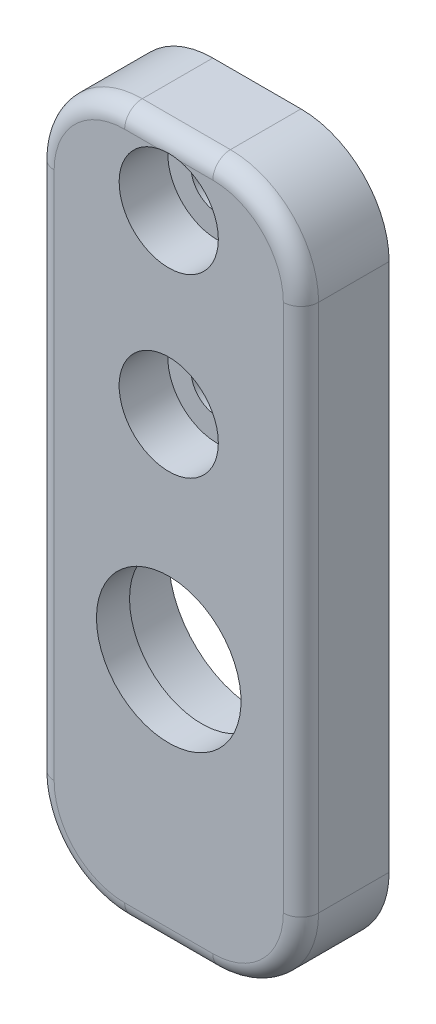
ISO-10303-21;
HEADER;
FILE_DESCRIPTION(('STEP AP214'),'2;1');
FILE_NAME('part.step','',(''),(''),'','','');
FILE_SCHEMA(('AUTOMOTIVE_DESIGN { 1 0 10303 214 1 1 1 1 }'));
ENDSEC;
DATA;
#1=APPLICATION_CONTEXT('core data for automotive mechanical design processes');
#2=APPLICATION_PROTOCOL_DEFINITION('international standard','automotive_design',2000,#1);
#3=PRODUCT_CONTEXT('',#1,'mechanical');
#4=PRODUCT('Part','Part','',(#3));
#5=PRODUCT_RELATED_PRODUCT_CATEGORY('part','',(#4));
#6=PRODUCT_DEFINITION_FORMATION('','',#4);
#7=PRODUCT_DEFINITION_CONTEXT('part definition',#1,'design');
#8=PRODUCT_DEFINITION('design','',#6,#7);
#9=PRODUCT_DEFINITION_SHAPE('','',#8);
#10=(LENGTH_UNIT() NAMED_UNIT(*) SI_UNIT(.MILLI.,.METRE.));
#11=(NAMED_UNIT(*) PLANE_ANGLE_UNIT() SI_UNIT($,.RADIAN.));
#12=(NAMED_UNIT(*) SI_UNIT($,.STERADIAN.) SOLID_ANGLE_UNIT());
#13=UNCERTAINTY_MEASURE_WITH_UNIT(LENGTH_MEASURE(1.E-05),#10,'distance_accuracy_value','');
#14=(GEOMETRIC_REPRESENTATION_CONTEXT(3) GLOBAL_UNCERTAINTY_ASSIGNED_CONTEXT((#13)) GLOBAL_UNIT_ASSIGNED_CONTEXT((#10,
#11,#12)) REPRESENTATION_CONTEXT('',''));
#15=CARTESIAN_POINT('',(0.,0.,0.));
#16=DIRECTION('',(0.,0.,1.));
#17=DIRECTION('',(1.,0.,0.));
#18=AXIS2_PLACEMENT_3D('',#15,#16,#17);
#19=CARTESIAN_POINT('',(9.525,18.034,0.));
#20=DIRECTION('',(0.,0.,-1.));
#21=DIRECTION('',(-1.,0.,0.));
#22=AXIS2_PLACEMENT_3D('',#19,#20,#21);
#23=CYLINDRICAL_SURFACE('',#22,5.207);
#24=CARTESIAN_POINT('',(9.525,18.034,0.));
#25=DIRECTION('',(0.,0.,-1.));
#26=DIRECTION('',(-1.,0.,0.));
#27=AXIS2_PLACEMENT_3D('',#24,#25,#26);
#28=CIRCLE('',#27,5.207);
#29=CARTESIAN_POINT('',(4.318,18.034,0.));
#30=VERTEX_POINT('',#29);
#31=EDGE_CURVE('E292',#30,#30,#28,.T.);
#32=ORIENTED_EDGE('',*,*,#31,.F.);
#33=EDGE_LOOP('',(#32));
#34=FACE_BOUND('',#33,.T.);
#35=CARTESIAN_POINT('',(9.525,18.034,-2.38252000000001));
#36=DIRECTION('',(0.,0.,-1.));
#37=DIRECTION('',(-1.,0.,0.));
#38=AXIS2_PLACEMENT_3D('',#35,#36,#37);
#39=CIRCLE('',#38,5.207);
#40=CARTESIAN_POINT('',(4.318,18.034,-2.38252000000001));
#41=VERTEX_POINT('',#40);
#42=EDGE_CURVE('E375',#41,#41,#39,.T.);
#43=ORIENTED_EDGE('',*,*,#42,.T.);
#44=EDGE_LOOP('',(#43));
#45=FACE_BOUND('',#44,.T.);
#46=ADVANCED_FACE('F32',(#34,#45),#23,.F.);
#47=CARTESIAN_POINT('',(19.05,0.,0.));
#48=DIRECTION('',(0.,1.,0.));
#49=DIRECTION('',(0.,0.,1.));
#50=AXIS2_PLACEMENT_3D('',#47,#48,#49);
#51=PLANE('',#50);
#52=DIRECTION('',(0.,0.,-1.));
#53=VECTOR('',#52,1.);
#54=CARTESIAN_POINT('',(12.7,0.,0.));
#55=LINE('',#54,#53);
#56=CARTESIAN_POINT('',(12.7,0.,-6.35000000000001));
#57=VERTEX_POINT('',#56);
#58=CARTESIAN_POINT('',(12.7,0.,-1.27));
#59=VERTEX_POINT('',#58);
#60=EDGE_CURVE('E166',#57,#59,#55,.F.);
#61=ORIENTED_EDGE('',*,*,#60,.T.);
#62=DIRECTION('',(-1.,0.,0.));
#63=VECTOR('',#62,1.);
#64=CARTESIAN_POINT('',(19.05,0.,-1.27));
#65=LINE('',#64,#63);
#66=CARTESIAN_POINT('',(6.35,0.,-1.27));
#67=VERTEX_POINT('',#66);
#68=EDGE_CURVE('E314',#59,#67,#65,.T.);
#69=ORIENTED_EDGE('',*,*,#68,.T.);
#70=DIRECTION('',(0.,0.,-1.));
#71=VECTOR('',#70,1.);
#72=CARTESIAN_POINT('',(6.35,0.,-6.35000000000001));
#73=LINE('',#72,#71);
#74=CARTESIAN_POINT('',(6.35,0.,-6.35000000000001));
#75=VERTEX_POINT('',#74);
#76=EDGE_CURVE('E168',#67,#75,#73,.T.);
#77=ORIENTED_EDGE('',*,*,#76,.T.);
#78=DIRECTION('',(-1.,0.,0.));
#79=VECTOR('',#78,1.);
#80=CARTESIAN_POINT('',(19.05,0.,-6.35000000000001));
#81=LINE('',#80,#79);
#82=EDGE_CURVE('E141',#57,#75,#81,.T.);
#83=ORIENTED_EDGE('',*,*,#82,.F.);
#84=EDGE_LOOP('',(#61,#69,#77,#83));
#85=FACE_BOUND('',#84,.T.);
#86=ADVANCED_FACE('F235',(#85),#51,.F.);
#87=CARTESIAN_POINT('',(19.05,50.8,-6.35));
#88=DIRECTION('',(0.,0.,1.));
#89=DIRECTION('',(0.,-1.,0.));
#90=AXIS2_PLACEMENT_3D('',#87,#88,#89);
#91=PLANE('',#90);
#92=CARTESIAN_POINT('',(9.525,18.034,-6.35000000000001));
#93=DIRECTION('',(0.,0.,-1.));
#94=DIRECTION('',(-1.,0.,0.));
#95=AXIS2_PLACEMENT_3D('',#92,#93,#94);
#96=CIRCLE('',#95,6.35);
#97=CARTESIAN_POINT('',(3.175,18.034,-6.35000000000001));
#98=VERTEX_POINT('',#97);
#99=EDGE_CURVE('E349',#98,#98,#96,.T.);
#100=ORIENTED_EDGE('',*,*,#99,.F.);
#101=EDGE_LOOP('',(#100));
#102=FACE_BOUND('',#101,.T.);
#103=CARTESIAN_POINT('',(9.52499999999999,46.0375,-6.35));
#104=DIRECTION('',(0.,0.,1.));
#105=DIRECTION('',(1.,0.,0.));
#106=AXIS2_PLACEMENT_3D('',#103,#104,#105);
#107=CIRCLE('',#106,1.89865);
#108=CARTESIAN_POINT('',(11.42365,46.0375,-6.35));
#109=VERTEX_POINT('',#108);
#110=EDGE_CURVE('E354',#109,#109,#107,.T.);
#111=ORIENTED_EDGE('',*,*,#110,.T.);
#112=EDGE_LOOP('',(#111));
#113=FACE_BOUND('',#112,.T.);
#114=CARTESIAN_POINT('',(9.525,33.3375,-6.35));
#115=DIRECTION('',(0.,0.,1.));
#116=DIRECTION('',(1.,0.,0.));
#117=AXIS2_PLACEMENT_3D('',#114,#115,#116);
#118=CIRCLE('',#117,1.89865);
#119=CARTESIAN_POINT('',(11.42365,33.3375,-6.35));
#120=VERTEX_POINT('',#119);
#121=EDGE_CURVE('E365',#120,#120,#118,.T.);
#122=ORIENTED_EDGE('',*,*,#121,.T.);
#123=EDGE_LOOP('',(#122));
#124=FACE_BOUND('',#123,.T.);
#125=DIRECTION('',(0.,1.,0.));
#126=VECTOR('',#125,1.);
#127=CARTESIAN_POINT('',(0.,50.8,-6.35));
#128=LINE('',#127,#126);
#129=CARTESIAN_POINT('',(0.,6.35,-6.35));
#130=VERTEX_POINT('',#129);
#131=CARTESIAN_POINT('',(0.,44.45,-6.35));
#132=VERTEX_POINT('',#131);
#133=EDGE_CURVE('E290',#130,#132,#128,.T.);
#134=ORIENTED_EDGE('',*,*,#133,.T.);
#135=CARTESIAN_POINT('',(6.35,44.45,-6.35));
#136=DIRECTION('',(0.,0.,1.));
#137=DIRECTION('',(0.,-1.,0.));
#138=AXIS2_PLACEMENT_3D('',#135,#136,#137);
#139=CIRCLE('',#138,6.35);
#140=CARTESIAN_POINT('',(6.35,50.8,-6.35));
#141=VERTEX_POINT('',#140);
#142=EDGE_CURVE('E150',#132,#141,#139,.F.);
#143=ORIENTED_EDGE('',*,*,#142,.T.);
#144=DIRECTION('',(-1.,0.,0.));
#145=VECTOR('',#144,1.);
#146=CARTESIAN_POINT('',(19.05,50.8,-6.35));
#147=LINE('',#146,#145);
#148=CARTESIAN_POINT('',(12.7,50.8,-6.35));
#149=VERTEX_POINT('',#148);
#150=EDGE_CURVE('E132',#149,#141,#147,.T.);
#151=ORIENTED_EDGE('',*,*,#150,.F.);
#152=CARTESIAN_POINT('',(12.7,44.45,-6.35));
#153=DIRECTION('',(0.,0.,1.));
#154=DIRECTION('',(0.,-1.,0.));
#155=AXIS2_PLACEMENT_3D('',#152,#153,#154);
#156=CIRCLE('',#155,6.35);
#157=CARTESIAN_POINT('',(19.05,44.45,-6.35));
#158=VERTEX_POINT('',#157);
#159=EDGE_CURVE('E147',#149,#158,#156,.F.);
#160=ORIENTED_EDGE('',*,*,#159,.T.);
#161=DIRECTION('',(0.,1.,0.));
#162=VECTOR('',#161,1.);
#163=CARTESIAN_POINT('',(19.05,50.8,-6.35));
#164=LINE('',#163,#162);
#165=CARTESIAN_POINT('',(19.05,6.35,-6.35));
#166=VERTEX_POINT('',#165);
#167=EDGE_CURVE('E151',#166,#158,#164,.T.);
#168=ORIENTED_EDGE('',*,*,#167,.F.);
#169=CARTESIAN_POINT('',(12.7,6.35,-6.35));
#170=DIRECTION('',(0.,0.,1.));
#171=DIRECTION('',(0.,-1.,0.));
#172=AXIS2_PLACEMENT_3D('',#169,#170,#171);
#173=CIRCLE('',#172,6.35);
#174=EDGE_CURVE('E160',#166,#57,#173,.F.);
#175=ORIENTED_EDGE('',*,*,#174,.T.);
#176=ORIENTED_EDGE('',*,*,#82,.T.);
#177=CARTESIAN_POINT('',(6.35,6.35,-6.35));
#178=DIRECTION('',(0.,0.,1.));
#179=DIRECTION('',(0.,-1.,0.));
#180=AXIS2_PLACEMENT_3D('',#177,#178,#179);
#181=CIRCLE('',#180,6.35);
#182=EDGE_CURVE('E156',#75,#130,#181,.F.);
#183=ORIENTED_EDGE('',*,*,#182,.T.);
#184=EDGE_LOOP('',(#134,#143,#151,#160,#168,#175,#176,#183));
#185=FACE_BOUND('',#184,.T.);
#186=ADVANCED_FACE('F145',(#102,#113,#124,#185),#91,.F.);
#187=CARTESIAN_POINT('',(19.05,50.8,0.));
#188=DIRECTION('',(0.,-1.,0.));
#189=DIRECTION('',(0.,0.,-1.));
#190=AXIS2_PLACEMENT_3D('',#187,#188,#189);
#191=PLANE('',#190);
#192=DIRECTION('',(0.,0.,1.));
#193=VECTOR('',#192,1.);
#194=CARTESIAN_POINT('',(6.35,50.8,0.));
#195=LINE('',#194,#193);
#196=CARTESIAN_POINT('',(6.35,50.8,-1.27));
#197=VERTEX_POINT('',#196);
#198=EDGE_CURVE('E140',#141,#197,#195,.T.);
#199=ORIENTED_EDGE('',*,*,#198,.T.);
#200=DIRECTION('',(-1.,0.,0.));
#201=VECTOR('',#200,1.);
#202=CARTESIAN_POINT('',(19.05,50.8,-1.27));
#203=LINE('',#202,#201);
#204=CARTESIAN_POINT('',(12.7,50.8,-1.27));
#205=VERTEX_POINT('',#204);
#206=EDGE_CURVE('E135',#197,#205,#203,.F.);
#207=ORIENTED_EDGE('',*,*,#206,.T.);
#208=DIRECTION('',(0.,0.,1.));
#209=VECTOR('',#208,1.);
#210=CARTESIAN_POINT('',(12.7,50.8,0.));
#211=LINE('',#210,#209);
#212=EDGE_CURVE('E128',#205,#149,#211,.F.);
#213=ORIENTED_EDGE('',*,*,#212,.T.);
#214=ORIENTED_EDGE('',*,*,#150,.T.);
#215=EDGE_LOOP('',(#199,#207,#213,#214));
#216=FACE_BOUND('',#215,.T.);
#217=ADVANCED_FACE('F131',(#216),#191,.F.);
#218=CARTESIAN_POINT('',(19.05,0.,0.));
#219=DIRECTION('',(0.,0.,-1.));
#220=DIRECTION('',(-1.,0.,0.));
#221=AXIS2_PLACEMENT_3D('',#218,#219,#220);
#222=PLANE('',#221);
#223=CARTESIAN_POINT('',(12.7,44.45,0.));
#224=DIRECTION('',(0.,0.,-1.));
#225=DIRECTION('',(-1.,0.,0.));
#226=AXIS2_PLACEMENT_3D('',#223,#224,#225);
#227=CIRCLE('',#226,5.08);
#228=CARTESIAN_POINT('',(17.78,44.45,0.));
#229=VERTEX_POINT('',#228);
#230=CARTESIAN_POINT('',(12.7,49.53,0.));
#231=VERTEX_POINT('',#230);
#232=EDGE_CURVE('E184',#229,#231,#227,.F.);
#233=ORIENTED_EDGE('',*,*,#232,.T.);
#234=DIRECTION('',(-1.,0.,0.));
#235=VECTOR('',#234,1.);
#236=CARTESIAN_POINT('',(19.05,49.53,0.));
#237=LINE('',#236,#235);
#238=CARTESIAN_POINT('',(10.2768453631565,49.53,0.));
#239=VERTEX_POINT('',#238);
#240=EDGE_CURVE('E187',#231,#239,#237,.T.);
#241=ORIENTED_EDGE('',*,*,#240,.T.);
#242=CARTESIAN_POINT('',(9.52499999999999,46.0375,0.));
#243=DIRECTION('',(0.,0.,1.));
#244=DIRECTION('',(1.,0.,0.));
#245=AXIS2_PLACEMENT_3D('',#242,#243,#244);
#246=CIRCLE('',#245,3.57250999999999);
#247=CARTESIAN_POINT('',(8.77315463684349,49.53,0.));
#248=VERTEX_POINT('',#247);
#249=EDGE_CURVE('E335',#248,#239,#246,.T.);
#250=ORIENTED_EDGE('',*,*,#249,.F.);
#251=DIRECTION('',(-1.,0.,0.));
#252=VECTOR('',#251,1.);
#253=CARTESIAN_POINT('',(19.05,49.53,0.));
#254=LINE('',#253,#252);
#255=CARTESIAN_POINT('',(6.35,49.53,0.));
#256=VERTEX_POINT('',#255);
#257=EDGE_CURVE('E182',#248,#256,#254,.T.);
#258=ORIENTED_EDGE('',*,*,#257,.T.);
#259=CARTESIAN_POINT('',(6.35,44.45,0.));
#260=DIRECTION('',(0.,0.,-1.));
#261=DIRECTION('',(-1.,0.,0.));
#262=AXIS2_PLACEMENT_3D('',#259,#260,#261);
#263=CIRCLE('',#262,5.08);
#264=CARTESIAN_POINT('',(1.27,44.45,0.));
#265=VERTEX_POINT('',#264);
#266=EDGE_CURVE('E180',#256,#265,#263,.F.);
#267=ORIENTED_EDGE('',*,*,#266,.T.);
#268=DIRECTION('',(0.,-1.,0.));
#269=VECTOR('',#268,1.);
#270=CARTESIAN_POINT('',(1.27,6.35,0.));
#271=LINE('',#270,#269);
#272=CARTESIAN_POINT('',(1.27,6.35,0.));
#273=VERTEX_POINT('',#272);
#274=EDGE_CURVE('E178',#265,#273,#271,.T.);
#275=ORIENTED_EDGE('',*,*,#274,.T.);
#276=CARTESIAN_POINT('',(6.35,6.35,0.));
#277=DIRECTION('',(0.,0.,-1.));
#278=DIRECTION('',(-1.,0.,0.));
#279=AXIS2_PLACEMENT_3D('',#276,#277,#278);
#280=CIRCLE('',#279,5.08);
#281=CARTESIAN_POINT('',(6.35,1.27,0.));
#282=VERTEX_POINT('',#281);
#283=EDGE_CURVE('E176',#273,#282,#280,.F.);
#284=ORIENTED_EDGE('',*,*,#283,.T.);
#285=DIRECTION('',(-1.,0.,0.));
#286=VECTOR('',#285,1.);
#287=CARTESIAN_POINT('',(19.05,1.27,0.));
#288=LINE('',#287,#286);
#289=CARTESIAN_POINT('',(12.7,1.27,0.));
#290=VERTEX_POINT('',#289);
#291=EDGE_CURVE('E174',#282,#290,#288,.F.);
#292=ORIENTED_EDGE('',*,*,#291,.T.);
#293=CARTESIAN_POINT('',(12.7,6.35,0.));
#294=DIRECTION('',(0.,0.,-1.));
#295=DIRECTION('',(-1.,0.,0.));
#296=AXIS2_PLACEMENT_3D('',#293,#294,#295);
#297=CIRCLE('',#296,5.08);
#298=CARTESIAN_POINT('',(17.78,6.35,0.));
#299=VERTEX_POINT('',#298);
#300=EDGE_CURVE('E172',#290,#299,#297,.F.);
#301=ORIENTED_EDGE('',*,*,#300,.T.);
#302=DIRECTION('',(0.,-1.,0.));
#303=VECTOR('',#302,1.);
#304=CARTESIAN_POINT('',(17.78,0.,0.));
#305=LINE('',#304,#303);
#306=EDGE_CURVE('E170',#299,#229,#305,.F.);
#307=ORIENTED_EDGE('',*,*,#306,.T.);
#308=EDGE_LOOP('',(#233,#241,#250,#258,#267,#275,#284,#292,#301,#307));
#309=FACE_BOUND('',#308,.T.);
#310=CARTESIAN_POINT('',(9.525,33.3375,0.));
#311=DIRECTION('',(0.,0.,1.));
#312=DIRECTION('',(1.,0.,0.));
#313=AXIS2_PLACEMENT_3D('',#310,#311,#312);
#314=CIRCLE('',#313,3.57250999999999);
#315=CARTESIAN_POINT('',(13.09751,33.3375,0.));
#316=VERTEX_POINT('',#315);
#317=EDGE_CURVE('E357',#316,#316,#314,.T.);
#318=ORIENTED_EDGE('',*,*,#317,.F.);
#319=EDGE_LOOP('',(#318));
#320=FACE_BOUND('',#319,.T.);
#321=ORIENTED_EDGE('',*,*,#31,.T.);
#322=EDGE_LOOP('',(#321));
#323=FACE_BOUND('',#322,.T.);
#324=ADVANCED_FACE('F240',(#309,#320,#323),#222,.F.);
#325=CARTESIAN_POINT('',(19.05,0.,-6.35000000000001));
#326=DIRECTION('',(-1.,0.,0.));
#327=DIRECTION('',(0.,0.,1.));
#328=AXIS2_PLACEMENT_3D('',#325,#326,#327);
#329=PLANE('',#328);
#330=DIRECTION('',(0.,0.,1.));
#331=VECTOR('',#330,1.);
#332=CARTESIAN_POINT('',(19.05,44.45,-6.35000000000001));
#333=LINE('',#332,#331);
#334=CARTESIAN_POINT('',(19.05,44.45,-1.27));
#335=VERTEX_POINT('',#334);
#336=EDGE_CURVE('E155',#158,#335,#333,.T.);
#337=ORIENTED_EDGE('',*,*,#336,.T.);
#338=DIRECTION('',(0.,-1.,0.));
#339=VECTOR('',#338,1.);
#340=CARTESIAN_POINT('',(19.05,0.,-1.27));
#341=LINE('',#340,#339);
#342=CARTESIAN_POINT('',(19.05,6.35,-1.27));
#343=VERTEX_POINT('',#342);
#344=EDGE_CURVE('E11',#335,#343,#341,.T.);
#345=ORIENTED_EDGE('',*,*,#344,.T.);
#346=DIRECTION('',(0.,0.,-1.));
#347=VECTOR('',#346,1.);
#348=CARTESIAN_POINT('',(19.05,6.35,-6.35000000000001));
#349=LINE('',#348,#347);
#350=EDGE_CURVE('E158',#343,#166,#349,.T.);
#351=ORIENTED_EDGE('',*,*,#350,.T.);
#352=ORIENTED_EDGE('',*,*,#167,.T.);
#353=EDGE_LOOP('',(#337,#345,#351,#352));
#354=FACE_BOUND('',#353,.T.);
#355=ADVANCED_FACE('F237',(#354),#329,.F.);
#356=CARTESIAN_POINT('',(0.,0.,-6.35000000000001));
#357=DIRECTION('',(-1.,0.,0.));
#358=DIRECTION('',(0.,0.,1.));
#359=AXIS2_PLACEMENT_3D('',#356,#357,#358);
#360=PLANE('',#359);
#361=DIRECTION('',(0.,0.,-1.));
#362=VECTOR('',#361,1.);
#363=CARTESIAN_POINT('',(0.,6.35,0.));
#364=LINE('',#363,#362);
#365=CARTESIAN_POINT('',(0.,6.35,-1.27));
#366=VERTEX_POINT('',#365);
#367=EDGE_CURVE('E300',#130,#366,#364,.F.);
#368=ORIENTED_EDGE('',*,*,#367,.T.);
#369=DIRECTION('',(0.,-1.,0.));
#370=VECTOR('',#369,1.);
#371=CARTESIAN_POINT('',(0.,44.45,-1.27));
#372=LINE('',#371,#370);
#373=CARTESIAN_POINT('',(0.,44.45,-1.27));
#374=VERTEX_POINT('',#373);
#375=EDGE_CURVE('E566',#366,#374,#372,.F.);
#376=ORIENTED_EDGE('',*,*,#375,.T.);
#377=DIRECTION('',(0.,0.,1.));
#378=VECTOR('',#377,1.);
#379=CARTESIAN_POINT('',(0.,44.45,-6.35));
#380=LINE('',#379,#378);
#381=EDGE_CURVE('E303',#374,#132,#380,.F.);
#382=ORIENTED_EDGE('',*,*,#381,.T.);
#383=ORIENTED_EDGE('',*,*,#133,.F.);
#384=EDGE_LOOP('',(#368,#376,#382,#383));
#385=FACE_BOUND('',#384,.T.);
#386=ADVANCED_FACE('F231',(#385),#360,.T.);
#387=CARTESIAN_POINT('',(9.525,33.3375,0.));
#388=DIRECTION('',(0.,0.,1.));
#389=DIRECTION('',(1.,0.,0.));
#390=AXIS2_PLACEMENT_3D('',#387,#388,#389);
#391=CYLINDRICAL_SURFACE('',#390,1.89865);
#392=ORIENTED_EDGE('',*,*,#121,.F.);
#393=EDGE_LOOP('',(#392));
#394=FACE_BOUND('',#393,.T.);
#395=CARTESIAN_POINT('',(9.525,33.3375,-3.5052));
#396=DIRECTION('',(0.,0.,1.));
#397=DIRECTION('',(1.,0.,0.));
#398=AXIS2_PLACEMENT_3D('',#395,#396,#397);
#399=CIRCLE('',#398,1.89865);
#400=CARTESIAN_POINT('',(11.42365,33.3375,-3.5052));
#401=VERTEX_POINT('',#400);
#402=EDGE_CURVE('E363',#401,#401,#399,.T.);
#403=ORIENTED_EDGE('',*,*,#402,.T.);
#404=EDGE_LOOP('',(#403));
#405=FACE_BOUND('',#404,.T.);
#406=ADVANCED_FACE('F227',(#394,#405),#391,.F.);
#407=CARTESIAN_POINT('',(11.42365,33.3375,-3.5052));
#408=DIRECTION('',(0.,0.,-1.));
#409=DIRECTION('',(-1.,0.,0.));
#410=AXIS2_PLACEMENT_3D('',#407,#408,#409);
#411=PLANE('',#410);
#412=ORIENTED_EDGE('',*,*,#402,.F.);
#413=EDGE_LOOP('',(#412));
#414=FACE_BOUND('',#413,.T.);
#415=CARTESIAN_POINT('',(9.525,33.3375,-3.5052));
#416=DIRECTION('',(0.,0.,1.));
#417=DIRECTION('',(1.,0.,0.));
#418=AXIS2_PLACEMENT_3D('',#415,#416,#417);
#419=CIRCLE('',#418,3.57251);
#420=CARTESIAN_POINT('',(13.09751,33.3375,-3.5052));
#421=VERTEX_POINT('',#420);
#422=EDGE_CURVE('E360',#421,#421,#419,.T.);
#423=ORIENTED_EDGE('',*,*,#422,.T.);
#424=EDGE_LOOP('',(#423));
#425=FACE_BOUND('',#424,.T.);
#426=ADVANCED_FACE('F223',(#414,#425),#411,.F.);
#427=CARTESIAN_POINT('',(9.525,33.3375,0.));
#428=DIRECTION('',(0.,0.,1.));
#429=DIRECTION('',(1.,0.,0.));
#430=AXIS2_PLACEMENT_3D('',#427,#428,#429);
#431=CYLINDRICAL_SURFACE('',#430,3.57251);
#432=ORIENTED_EDGE('',*,*,#422,.F.);
#433=EDGE_LOOP('',(#432));
#434=FACE_BOUND('',#433,.T.);
#435=ORIENTED_EDGE('',*,*,#317,.T.);
#436=EDGE_LOOP('',(#435));
#437=FACE_BOUND('',#436,.T.);
#438=ADVANCED_FACE('F219',(#434,#437),#431,.F.);
#439=CARTESIAN_POINT('',(9.52499999999999,46.0375,0.));
#440=DIRECTION('',(0.,0.,1.));
#441=DIRECTION('',(1.,0.,0.));
#442=AXIS2_PLACEMENT_3D('',#439,#440,#441);
#443=CYLINDRICAL_SURFACE('',#442,1.89865);
#444=ORIENTED_EDGE('',*,*,#110,.F.);
#445=EDGE_LOOP('',(#444));
#446=FACE_BOUND('',#445,.T.);
#447=CARTESIAN_POINT('',(9.52499999999999,46.0375,-3.5052));
#448=DIRECTION('',(0.,0.,1.));
#449=DIRECTION('',(1.,0.,0.));
#450=AXIS2_PLACEMENT_3D('',#447,#448,#449);
#451=CIRCLE('',#450,1.89865);
#452=CARTESIAN_POINT('',(11.42365,46.0375,-3.5052));
#453=VERTEX_POINT('',#452);
#454=EDGE_CURVE('E346',#453,#453,#451,.T.);
#455=ORIENTED_EDGE('',*,*,#454,.T.);
#456=EDGE_LOOP('',(#455));
#457=FACE_BOUND('',#456,.T.);
#458=ADVANCED_FACE('F215',(#446,#457),#443,.F.);
#459=CARTESIAN_POINT('',(11.42365,46.0375,-3.5052));
#460=DIRECTION('',(0.,0.,-1.));
#461=DIRECTION('',(-1.,0.,0.));
#462=AXIS2_PLACEMENT_3D('',#459,#460,#461);
#463=PLANE('',#462);
#464=ORIENTED_EDGE('',*,*,#454,.F.);
#465=EDGE_LOOP('',(#464));
#466=FACE_BOUND('',#465,.T.);
#467=CARTESIAN_POINT('',(9.52499999999999,46.0375,-3.5052));
#468=DIRECTION('',(0.,0.,1.));
#469=DIRECTION('',(1.,0.,0.));
#470=AXIS2_PLACEMENT_3D('',#467,#468,#469);
#471=CIRCLE('',#470,3.57251);
#472=CARTESIAN_POINT('',(13.09751,46.0375,-3.5052));
#473=VERTEX_POINT('',#472);
#474=EDGE_CURVE('E340',#473,#473,#471,.T.);
#475=ORIENTED_EDGE('',*,*,#474,.T.);
#476=EDGE_LOOP('',(#475));
#477=FACE_BOUND('',#476,.T.);
#478=ADVANCED_FACE('F209',(#466,#477),#463,.F.);
#479=CARTESIAN_POINT('',(9.52499999999999,46.0375,0.));
#480=DIRECTION('',(0.,0.,1.));
#481=DIRECTION('',(1.,0.,0.));
#482=AXIS2_PLACEMENT_3D('',#479,#480,#481);
#483=CYLINDRICAL_SURFACE('',#482,3.57251);
#484=ORIENTED_EDGE('',*,*,#474,.F.);
#485=EDGE_LOOP('',(#484));
#486=FACE_BOUND('',#485,.T.);
#487=ORIENTED_EDGE('',*,*,#249,.T.);
#488=CARTESIAN_POINT('',(10.2768453631565,49.53,0.));
#489=CARTESIAN_POINT('',(10.2273521218033,49.5406545092437,-3.92462751238458E-06));
#490=CARTESIAN_POINT('',(10.177639156777,49.5502555193637,-0.00013349214971235));
#491=CARTESIAN_POINT('',(10.0778502353875,49.5673367679829,-0.00051951923269982));
#492=CARTESIAN_POINT('',(10.0277742761021,49.5748169893896,-0.000775979816136989));
#493=CARTESIAN_POINT('',(9.87708716873082,49.5940594888495,-0.00154926005581477));
#494=CARTESIAN_POINT('',(9.77604706943469,49.6026170869488,-0.00206982407637424));
#495=CARTESIAN_POINT('',(9.57539182559674,49.611041634885,-0.00258225613781227));
#496=CARTESIAN_POINT('',(9.47578265681987,49.6110579267881,-0.00258320942161197));
#497=CARTESIAN_POINT('',(9.27696159657266,49.6027759998469,-0.00207951103605163));
#498=CARTESIAN_POINT('',(9.17774948733159,49.5944832360082,-0.00157519108530436));
#499=CARTESIAN_POINT('',(9.0278612699974,49.5756277723678,-0.000804601671630059));
#500=CARTESIAN_POINT('',(8.97678920064301,49.5680746692043,-0.000540489043507389));
#501=CARTESIAN_POINT('',(8.87478482386265,49.550723030334,-0.000140150899497991));
#502=CARTESIAN_POINT('',(8.8238542503645,49.5409142886161,-4.52145979865636E-06));
#503=CARTESIAN_POINT('',(8.77315463684348,49.53,0.));
#504=B_SPLINE_CURVE_WITH_KNOTS('',3,(#488,#489,#490,#491,#492,#493,#494,#495,#496,#497,#498,
#499,#500,#501,#502,#503),.UNSPECIFIED.,.F.,.F.,(4,2,2,2,2,2,2,4),(0.,0.151856088059579,
0.303713399969426,0.607520636776616,0.906015718785188,1.2043149631217,1.35915744326305,
1.51471482089773),.UNSPECIFIED.);
#505=EDGE_CURVE('E191',#239,#248,#504,.T.);
#506=ORIENTED_EDGE('',*,*,#505,.T.);
#507=EDGE_LOOP('',(#487,#506));
#508=FACE_BOUND('',#507,.T.);
#509=ADVANCED_FACE('F203',(#486,#508),#483,.F.);
#510=CARTESIAN_POINT('',(6.35,44.45,0.));
#511=DIRECTION('',(0.,0.,-1.));
#512=DIRECTION('',(-1.,0.,0.));
#513=AXIS2_PLACEMENT_3D('',#510,#511,#512);
#514=CYLINDRICAL_SURFACE('',#513,6.35);
#515=ORIENTED_EDGE('',*,*,#381,.F.);
#516=CARTESIAN_POINT('',(6.35,44.45,-1.27));
#517=DIRECTION('',(0.,0.,-1.));
#518=DIRECTION('',(-1.,0.,0.));
#519=AXIS2_PLACEMENT_3D('',#516,#517,#518);
#520=CIRCLE('',#519,6.35);
#521=EDGE_CURVE('E569',#374,#197,#520,.T.);
#522=ORIENTED_EDGE('',*,*,#521,.T.);
#523=ORIENTED_EDGE('',*,*,#198,.F.);
#524=ORIENTED_EDGE('',*,*,#142,.F.);
#525=EDGE_LOOP('',(#515,#522,#523,#524));
#526=FACE_BOUND('',#525,.T.);
#527=ADVANCED_FACE('F208',(#526),#514,.T.);
#528=CARTESIAN_POINT('',(12.7,44.45,-6.35000000000001));
#529=DIRECTION('',(0.,0.,1.));
#530=DIRECTION('',(1.,0.,0.));
#531=AXIS2_PLACEMENT_3D('',#528,#529,#530);
#532=CYLINDRICAL_SURFACE('',#531,6.35);
#533=ORIENTED_EDGE('',*,*,#212,.F.);
#534=CARTESIAN_POINT('',(12.7,44.45,-1.27));
#535=DIRECTION('',(0.,0.,-1.));
#536=DIRECTION('',(-1.,0.,0.));
#537=AXIS2_PLACEMENT_3D('',#534,#535,#536);
#538=CIRCLE('',#537,6.35);
#539=EDGE_CURVE('E189',#205,#335,#538,.T.);
#540=ORIENTED_EDGE('',*,*,#539,.T.);
#541=ORIENTED_EDGE('',*,*,#336,.F.);
#542=ORIENTED_EDGE('',*,*,#159,.F.);
#543=EDGE_LOOP('',(#533,#540,#541,#542));
#544=FACE_BOUND('',#543,.T.);
#545=ADVANCED_FACE('F154',(#544),#532,.T.);
#546=CARTESIAN_POINT('',(6.35,6.35,0.));
#547=DIRECTION('',(0.,0.,1.));
#548=DIRECTION('',(1.,0.,0.));
#549=AXIS2_PLACEMENT_3D('',#546,#547,#548);
#550=CYLINDRICAL_SURFACE('',#549,6.35);
#551=ORIENTED_EDGE('',*,*,#76,.F.);
#552=CARTESIAN_POINT('',(6.35,6.35,-1.27));
#553=DIRECTION('',(0.,0.,-1.));
#554=DIRECTION('',(-1.,0.,0.));
#555=AXIS2_PLACEMENT_3D('',#552,#553,#554);
#556=CIRCLE('',#555,6.35);
#557=EDGE_CURVE('E316',#67,#366,#556,.T.);
#558=ORIENTED_EDGE('',*,*,#557,.T.);
#559=ORIENTED_EDGE('',*,*,#367,.F.);
#560=ORIENTED_EDGE('',*,*,#182,.F.);
#561=EDGE_LOOP('',(#551,#558,#559,#560));
#562=FACE_BOUND('',#561,.T.);
#563=ADVANCED_FACE('F260',(#562),#550,.T.);
#564=CARTESIAN_POINT('',(12.7,6.35,-6.35000000000001));
#565=DIRECTION('',(0.,0.,-1.));
#566=DIRECTION('',(-1.,0.,0.));
#567=AXIS2_PLACEMENT_3D('',#564,#565,#566);
#568=CYLINDRICAL_SURFACE('',#567,6.35);
#569=ORIENTED_EDGE('',*,*,#350,.F.);
#570=CARTESIAN_POINT('',(12.7,6.35,-1.27));
#571=DIRECTION('',(0.,0.,-1.));
#572=DIRECTION('',(-1.,0.,0.));
#573=AXIS2_PLACEMENT_3D('',#570,#571,#572);
#574=CIRCLE('',#573,6.35);
#575=EDGE_CURVE('E41',#343,#59,#574,.T.);
#576=ORIENTED_EDGE('',*,*,#575,.T.);
#577=ORIENTED_EDGE('',*,*,#60,.F.);
#578=ORIENTED_EDGE('',*,*,#174,.F.);
#579=EDGE_LOOP('',(#569,#576,#577,#578));
#580=FACE_BOUND('',#579,.T.);
#581=ADVANCED_FACE('F263',(#580),#568,.T.);
#582=CARTESIAN_POINT('',(6.35,6.35,-1.27));
#583=DIRECTION('',(0.,0.,-1.));
#584=DIRECTION('',(-1.,0.,0.));
#585=AXIS2_PLACEMENT_3D('',#582,#583,#584);
#586=TOROIDAL_SURFACE('',#585,5.08,1.27);
#587=CARTESIAN_POINT('',(1.27,6.35,-1.27));
#588=DIRECTION('',(0.,1.,0.));
#589=DIRECTION('',(0.,0.,1.));
#590=AXIS2_PLACEMENT_3D('',#587,#588,#589);
#591=CIRCLE('',#590,1.27);
#592=EDGE_CURVE('E328',#366,#273,#591,.T.);
#593=ORIENTED_EDGE('',*,*,#592,.F.);
#594=ORIENTED_EDGE('',*,*,#557,.F.);
#595=CARTESIAN_POINT('',(6.35,1.27,-1.27));
#596=DIRECTION('',(1.,0.,0.));
#597=DIRECTION('',(0.,0.,-1.));
#598=AXIS2_PLACEMENT_3D('',#595,#596,#597);
#599=CIRCLE('',#598,1.27);
#600=EDGE_CURVE('E36',#282,#67,#599,.T.);
#601=ORIENTED_EDGE('',*,*,#600,.F.);
#602=ORIENTED_EDGE('',*,*,#283,.F.);
#603=EDGE_LOOP('',(#593,#594,#601,#602));
#604=FACE_BOUND('',#603,.T.);
#605=ADVANCED_FACE('F34',(#604),#586,.T.);
#606=CARTESIAN_POINT('',(19.05,1.27,-1.27));
#607=DIRECTION('',(-1.,0.,0.));
#608=DIRECTION('',(0.,0.,1.));
#609=AXIS2_PLACEMENT_3D('',#606,#607,#608);
#610=CYLINDRICAL_SURFACE('',#609,1.27);
#611=ORIENTED_EDGE('',*,*,#600,.T.);
#612=ORIENTED_EDGE('',*,*,#68,.F.);
#613=CARTESIAN_POINT('',(12.7,1.27,-1.27));
#614=DIRECTION('',(1.,0.,0.));
#615=DIRECTION('',(0.,0.,-1.));
#616=AXIS2_PLACEMENT_3D('',#613,#614,#615);
#617=CIRCLE('',#616,1.27);
#618=EDGE_CURVE('E313',#290,#59,#617,.T.);
#619=ORIENTED_EDGE('',*,*,#618,.F.);
#620=ORIENTED_EDGE('',*,*,#291,.F.);
#621=EDGE_LOOP('',(#611,#612,#619,#620));
#622=FACE_BOUND('',#621,.T.);
#623=ADVANCED_FACE('F456',(#622),#610,.T.);
#624=CARTESIAN_POINT('',(1.27,0.,-1.27));
#625=DIRECTION('',(0.,1.,0.));
#626=DIRECTION('',(0.,0.,1.));
#627=AXIS2_PLACEMENT_3D('',#624,#625,#626);
#628=CYLINDRICAL_SURFACE('',#627,1.27);
#629=ORIENTED_EDGE('',*,*,#592,.T.);
#630=ORIENTED_EDGE('',*,*,#274,.F.);
#631=CARTESIAN_POINT('',(1.27,44.45,-1.27));
#632=DIRECTION('',(0.,1.,0.));
#633=DIRECTION('',(0.,0.,1.));
#634=AXIS2_PLACEMENT_3D('',#631,#632,#633);
#635=CIRCLE('',#634,1.27);
#636=EDGE_CURVE('E325',#374,#265,#635,.T.);
#637=ORIENTED_EDGE('',*,*,#636,.F.);
#638=ORIENTED_EDGE('',*,*,#375,.F.);
#639=EDGE_LOOP('',(#629,#630,#637,#638));
#640=FACE_BOUND('',#639,.T.);
#641=ADVANCED_FACE('F447',(#640),#628,.T.);
#642=CARTESIAN_POINT('',(12.7,6.35,-1.27));
#643=DIRECTION('',(0.,0.,-1.));
#644=DIRECTION('',(-1.,0.,0.));
#645=AXIS2_PLACEMENT_3D('',#642,#643,#644);
#646=TOROIDAL_SURFACE('',#645,5.08,1.27);
#647=ORIENTED_EDGE('',*,*,#618,.T.);
#648=ORIENTED_EDGE('',*,*,#575,.F.);
#649=CARTESIAN_POINT('',(17.78,6.35,-1.27));
#650=DIRECTION('',(0.,1.,0.));
#651=DIRECTION('',(0.,0.,1.));
#652=AXIS2_PLACEMENT_3D('',#649,#650,#651);
#653=CIRCLE('',#652,1.27);
#654=EDGE_CURVE('E288',#299,#343,#653,.T.);
#655=ORIENTED_EDGE('',*,*,#654,.F.);
#656=ORIENTED_EDGE('',*,*,#300,.F.);
#657=EDGE_LOOP('',(#647,#648,#655,#656));
#658=FACE_BOUND('',#657,.T.);
#659=ADVANCED_FACE('F310',(#658),#646,.T.);
#660=CARTESIAN_POINT('',(6.35,44.45,-1.27));
#661=DIRECTION('',(0.,0.,-1.));
#662=DIRECTION('',(-1.,0.,0.));
#663=AXIS2_PLACEMENT_3D('',#660,#661,#662);
#664=TOROIDAL_SURFACE('',#663,5.08,1.27);
#665=ORIENTED_EDGE('',*,*,#636,.T.);
#666=ORIENTED_EDGE('',*,*,#266,.F.);
#667=CARTESIAN_POINT('',(6.35,49.53,-1.27));
#668=DIRECTION('',(1.,0.,0.));
#669=DIRECTION('',(0.,0.,-1.));
#670=AXIS2_PLACEMENT_3D('',#667,#668,#669);
#671=CIRCLE('',#670,1.27);
#672=EDGE_CURVE('E283',#197,#256,#671,.T.);
#673=ORIENTED_EDGE('',*,*,#672,.F.);
#674=ORIENTED_EDGE('',*,*,#521,.F.);
#675=EDGE_LOOP('',(#665,#666,#673,#674));
#676=FACE_BOUND('',#675,.T.);
#677=ADVANCED_FACE('F430',(#676),#664,.T.);
#678=CARTESIAN_POINT('',(17.78,0.,-1.27));
#679=DIRECTION('',(0.,-1.,0.));
#680=DIRECTION('',(0.,0.,-1.));
#681=AXIS2_PLACEMENT_3D('',#678,#679,#680);
#682=CYLINDRICAL_SURFACE('',#681,1.27);
#683=ORIENTED_EDGE('',*,*,#654,.T.);
#684=ORIENTED_EDGE('',*,*,#344,.F.);
#685=CARTESIAN_POINT('',(17.78,44.45,-1.27));
#686=DIRECTION('',(0.,1.,0.));
#687=DIRECTION('',(0.,0.,1.));
#688=AXIS2_PLACEMENT_3D('',#685,#686,#687);
#689=CIRCLE('',#688,1.27);
#690=EDGE_CURVE('E279',#229,#335,#689,.T.);
#691=ORIENTED_EDGE('',*,*,#690,.F.);
#692=ORIENTED_EDGE('',*,*,#306,.F.);
#693=EDGE_LOOP('',(#683,#684,#691,#692));
#694=FACE_BOUND('',#693,.T.);
#695=ADVANCED_FACE('F275',(#694),#682,.T.);
#696=CARTESIAN_POINT('',(19.05,49.53,-1.27));
#697=DIRECTION('',(-1.,0.,0.));
#698=DIRECTION('',(0.,0.,1.));
#699=AXIS2_PLACEMENT_3D('',#696,#697,#698);
#700=CYLINDRICAL_SURFACE('',#699,1.27);
#701=ORIENTED_EDGE('',*,*,#505,.F.);
#702=ORIENTED_EDGE('',*,*,#240,.F.);
#703=CARTESIAN_POINT('',(12.7,49.53,-1.27));
#704=DIRECTION('',(1.,0.,0.));
#705=DIRECTION('',(0.,0.,-1.));
#706=AXIS2_PLACEMENT_3D('',#703,#704,#705);
#707=CIRCLE('',#706,1.27);
#708=EDGE_CURVE('E284',#205,#231,#707,.T.);
#709=ORIENTED_EDGE('',*,*,#708,.F.);
#710=ORIENTED_EDGE('',*,*,#206,.F.);
#711=ORIENTED_EDGE('',*,*,#672,.T.);
#712=ORIENTED_EDGE('',*,*,#257,.F.);
#713=EDGE_LOOP('',(#701,#702,#709,#710,#711,#712));
#714=FACE_BOUND('',#713,.T.);
#715=ADVANCED_FACE('F199',(#714),#700,.T.);
#716=CARTESIAN_POINT('',(12.7,44.45,-1.27));
#717=DIRECTION('',(0.,0.,-1.));
#718=DIRECTION('',(-1.,0.,0.));
#719=AXIS2_PLACEMENT_3D('',#716,#717,#718);
#720=TOROIDAL_SURFACE('',#719,5.08,1.27);
#721=ORIENTED_EDGE('',*,*,#690,.T.);
#722=ORIENTED_EDGE('',*,*,#539,.F.);
#723=ORIENTED_EDGE('',*,*,#708,.T.);
#724=ORIENTED_EDGE('',*,*,#232,.F.);
#725=EDGE_LOOP('',(#721,#722,#723,#724));
#726=FACE_BOUND('',#725,.T.);
#727=ADVANCED_FACE('F266',(#726),#720,.T.);
#728=CARTESIAN_POINT('',(9.525,18.034,-2.38252000000001));
#729=DIRECTION('',(0.,0.,-1.));
#730=DIRECTION('',(-1.,0.,0.));
#731=AXIS2_PLACEMENT_3D('',#728,#729,#730);
#732=CYLINDRICAL_SURFACE('',#731,6.35);
#733=CARTESIAN_POINT('',(9.525,18.034,-2.38252000000001));
#734=DIRECTION('',(0.,0.,-1.));
#735=DIRECTION('',(-1.,0.,0.));
#736=AXIS2_PLACEMENT_3D('',#733,#734,#735);
#737=CIRCLE('',#736,6.35);
#738=CARTESIAN_POINT('',(3.175,18.034,-2.38252000000001));
#739=VERTEX_POINT('',#738);
#740=EDGE_CURVE('E320',#739,#739,#737,.T.);
#741=ORIENTED_EDGE('',*,*,#740,.F.);
#742=EDGE_LOOP('',(#741));
#743=FACE_BOUND('',#742,.T.);
#744=ORIENTED_EDGE('',*,*,#99,.T.);
#745=EDGE_LOOP('',(#744));
#746=FACE_BOUND('',#745,.T.);
#747=ADVANCED_FACE('F211',(#743,#746),#732,.F.);
#748=CARTESIAN_POINT('',(9.525,18.034,-2.38252000000001));
#749=DIRECTION('',(0.,0.,-1.));
#750=DIRECTION('',(-1.,0.,0.));
#751=AXIS2_PLACEMENT_3D('',#748,#749,#750);
#752=PLANE('',#751);
#753=ORIENTED_EDGE('',*,*,#42,.F.);
#754=EDGE_LOOP('',(#753));
#755=FACE_BOUND('',#754,.T.);
#756=ORIENTED_EDGE('',*,*,#740,.T.);
#757=EDGE_LOOP('',(#756));
#758=FACE_BOUND('',#757,.T.);
#759=ADVANCED_FACE('F273',(#755,#758),#752,.T.);
#760=CLOSED_SHELL('',(#46,#86,#186,#217,#324,#355,#386,#406,#426,#438,#458,#478,#509,#527,#545,
#563,#581,#605,#623,#641,#659,#677,#695,#715,#727,#747,#759));
#761=MANIFOLD_SOLID_BREP('B2',#760);
#762=ADVANCED_BREP_SHAPE_REPRESENTATION('',(#18,#761),#14);
#763=SHAPE_DEFINITION_REPRESENTATION(#9,#762);
ENDSEC;
END-ISO-10303-21;
